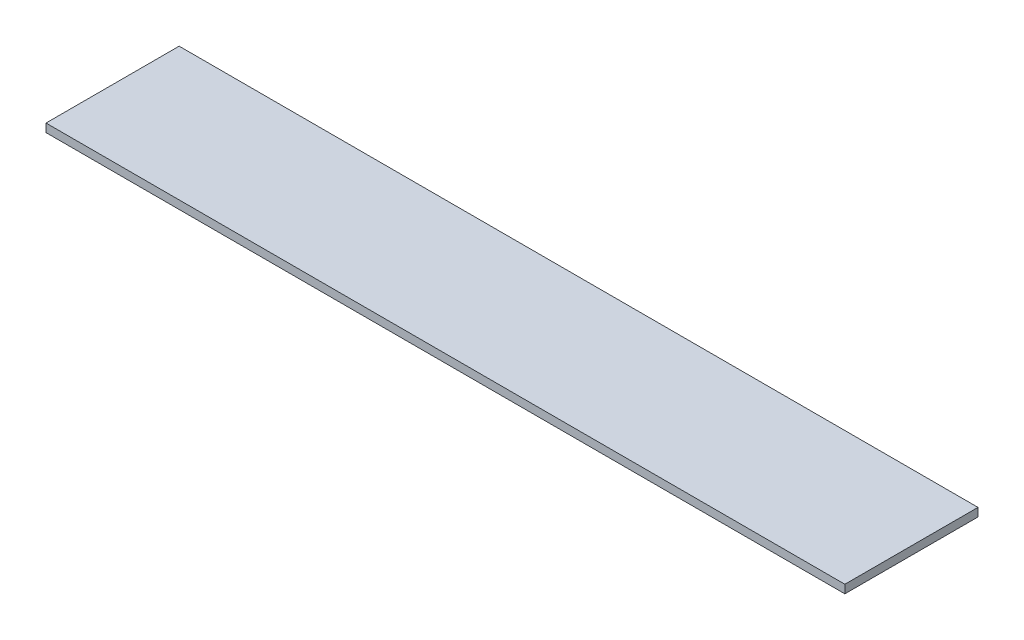
ISO-10303-21;
HEADER;
FILE_DESCRIPTION(('STEP AP214'),'2;1');
FILE_NAME('part.step','',(''),(''),'','','');
FILE_SCHEMA(('AUTOMOTIVE_DESIGN { 1 0 10303 214 1 1 1 1 }'));
ENDSEC;
DATA;
#1=APPLICATION_CONTEXT('core data for automotive mechanical design processes');
#2=APPLICATION_PROTOCOL_DEFINITION('international standard','automotive_design',2000,#1);
#3=PRODUCT_CONTEXT('',#1,'mechanical');
#4=PRODUCT('Part','Part','',(#3));
#5=PRODUCT_RELATED_PRODUCT_CATEGORY('part','',(#4));
#6=PRODUCT_DEFINITION_FORMATION('','',#4);
#7=PRODUCT_DEFINITION_CONTEXT('part definition',#1,'design');
#8=PRODUCT_DEFINITION('design','',#6,#7);
#9=PRODUCT_DEFINITION_SHAPE('','',#8);
#10=(LENGTH_UNIT() NAMED_UNIT(*) SI_UNIT(.MILLI.,.METRE.));
#11=(NAMED_UNIT(*) PLANE_ANGLE_UNIT() SI_UNIT($,.RADIAN.));
#12=(NAMED_UNIT(*) SI_UNIT($,.STERADIAN.) SOLID_ANGLE_UNIT());
#13=UNCERTAINTY_MEASURE_WITH_UNIT(LENGTH_MEASURE(1.E-05),#10,'distance_accuracy_value','');
#14=(GEOMETRIC_REPRESENTATION_CONTEXT(3) GLOBAL_UNCERTAINTY_ASSIGNED_CONTEXT((#13)) GLOBAL_UNIT_ASSIGNED_CONTEXT((#10,
#11,#12)) REPRESENTATION_CONTEXT('',''));
#15=CARTESIAN_POINT('',(0.,0.,0.));
#16=DIRECTION('',(0.,0.,1.));
#17=DIRECTION('',(1.,0.,0.));
#18=AXIS2_PLACEMENT_3D('',#15,#16,#17);
#19=CARTESIAN_POINT('',(0.,1.5875,0.));
#20=DIRECTION('',(1.,0.,0.));
#21=DIRECTION('',(0.,0.,-1.));
#22=AXIS2_PLACEMENT_3D('',#19,#20,#21);
#23=PLANE('',#22);
#24=DIRECTION('',(0.,0.,1.));
#25=VECTOR('',#24,1.);
#26=CARTESIAN_POINT('',(0.,0.,0.));
#27=LINE('',#26,#25);
#28=CARTESIAN_POINT('',(0.,0.,-25.4));
#29=VERTEX_POINT('',#28);
#30=CARTESIAN_POINT('',(0.,0.,0.));
#31=VERTEX_POINT('',#30);
#32=EDGE_CURVE('E96',#29,#31,#27,.T.);
#33=ORIENTED_EDGE('',*,*,#32,.T.);
#34=DIRECTION('',(0.,-1.,0.));
#35=VECTOR('',#34,1.);
#36=CARTESIAN_POINT('',(0.,1.5875,0.));
#37=LINE('',#36,#35);
#38=CARTESIAN_POINT('',(0.,1.5875,0.));
#39=VERTEX_POINT('',#38);
#40=EDGE_CURVE('E11',#39,#31,#37,.T.);
#41=ORIENTED_EDGE('',*,*,#40,.F.);
#42=DIRECTION('',(0.,0.,1.));
#43=VECTOR('',#42,1.);
#44=CARTESIAN_POINT('',(0.,1.5875,0.));
#45=LINE('',#44,#43);
#46=CARTESIAN_POINT('',(0.,1.5875,-25.4));
#47=VERTEX_POINT('',#46);
#48=EDGE_CURVE('E84',#47,#39,#45,.T.);
#49=ORIENTED_EDGE('',*,*,#48,.F.);
#50=DIRECTION('',(0.,-1.,0.));
#51=VECTOR('',#50,1.);
#52=CARTESIAN_POINT('',(0.,1.5875,-25.4));
#53=LINE('',#52,#51);
#54=EDGE_CURVE('E92',#47,#29,#53,.T.);
#55=ORIENTED_EDGE('',*,*,#54,.T.);
#56=EDGE_LOOP('',(#33,#41,#49,#55));
#57=FACE_BOUND('',#56,.T.);
#58=ADVANCED_FACE('F33',(#57),#23,.F.);
#59=CARTESIAN_POINT('',(0.,1.5875,0.));
#60=DIRECTION('',(0.,0.,-1.));
#61=DIRECTION('',(-1.,0.,0.));
#62=AXIS2_PLACEMENT_3D('',#59,#60,#61);
#63=PLANE('',#62);
#64=DIRECTION('',(1.,0.,0.));
#65=VECTOR('',#64,1.);
#66=CARTESIAN_POINT('',(0.,0.,0.));
#67=LINE('',#66,#65);
#68=CARTESIAN_POINT('',(152.4,0.,0.));
#69=VERTEX_POINT('',#68);
#70=EDGE_CURVE('E88',#31,#69,#67,.T.);
#71=ORIENTED_EDGE('',*,*,#70,.T.);
#72=DIRECTION('',(0.,-1.,0.));
#73=VECTOR('',#72,1.);
#74=CARTESIAN_POINT('',(152.4,1.5875,0.));
#75=LINE('',#74,#73);
#76=CARTESIAN_POINT('',(152.4,1.5875,0.));
#77=VERTEX_POINT('',#76);
#78=EDGE_CURVE('E41',#77,#69,#75,.T.);
#79=ORIENTED_EDGE('',*,*,#78,.F.);
#80=DIRECTION('',(1.,0.,0.));
#81=VECTOR('',#80,1.);
#82=CARTESIAN_POINT('',(0.,1.5875,0.));
#83=LINE('',#82,#81);
#84=EDGE_CURVE('E79',#39,#77,#83,.T.);
#85=ORIENTED_EDGE('',*,*,#84,.F.);
#86=ORIENTED_EDGE('',*,*,#40,.T.);
#87=EDGE_LOOP('',(#71,#79,#85,#86));
#88=FACE_BOUND('',#87,.T.);
#89=ADVANCED_FACE('F87',(#88),#63,.F.);
#90=CARTESIAN_POINT('',(152.4,1.5875,0.));
#91=DIRECTION('',(-1.,0.,0.));
#92=DIRECTION('',(0.,0.,1.));
#93=AXIS2_PLACEMENT_3D('',#90,#91,#92);
#94=PLANE('',#93);
#95=DIRECTION('',(0.,0.,-1.));
#96=VECTOR('',#95,1.);
#97=CARTESIAN_POINT('',(152.4,0.,0.));
#98=LINE('',#97,#96);
#99=CARTESIAN_POINT('',(152.4,0.,-25.4));
#100=VERTEX_POINT('',#99);
#101=EDGE_CURVE('E66',#69,#100,#98,.T.);
#102=ORIENTED_EDGE('',*,*,#101,.T.);
#103=DIRECTION('',(0.,-1.,0.));
#104=VECTOR('',#103,1.);
#105=CARTESIAN_POINT('',(152.4,1.5875,-25.4));
#106=LINE('',#105,#104);
#107=CARTESIAN_POINT('',(152.4,1.5875,-25.4));
#108=VERTEX_POINT('',#107);
#109=EDGE_CURVE('E89',#108,#100,#106,.T.);
#110=ORIENTED_EDGE('',*,*,#109,.F.);
#111=DIRECTION('',(0.,0.,-1.));
#112=VECTOR('',#111,1.);
#113=CARTESIAN_POINT('',(152.4,1.5875,0.));
#114=LINE('',#113,#112);
#115=EDGE_CURVE('E82',#77,#108,#114,.T.);
#116=ORIENTED_EDGE('',*,*,#115,.F.);
#117=ORIENTED_EDGE('',*,*,#78,.T.);
#118=EDGE_LOOP('',(#102,#110,#116,#117));
#119=FACE_BOUND('',#118,.T.);
#120=ADVANCED_FACE('F90',(#119),#94,.F.);
#121=CARTESIAN_POINT('',(0.,1.5875,-25.4));
#122=DIRECTION('',(0.,0.,1.));
#123=DIRECTION('',(1.,0.,0.));
#124=AXIS2_PLACEMENT_3D('',#121,#122,#123);
#125=PLANE('',#124);
#126=DIRECTION('',(-1.,0.,0.));
#127=VECTOR('',#126,1.);
#128=CARTESIAN_POINT('',(0.,0.,-25.4));
#129=LINE('',#128,#127);
#130=EDGE_CURVE('E72',#100,#29,#129,.T.);
#131=ORIENTED_EDGE('',*,*,#130,.T.);
#132=ORIENTED_EDGE('',*,*,#54,.F.);
#133=DIRECTION('',(-1.,0.,0.));
#134=VECTOR('',#133,1.);
#135=CARTESIAN_POINT('',(0.,1.5875,-25.4));
#136=LINE('',#135,#134);
#137=EDGE_CURVE('E49',#108,#47,#136,.T.);
#138=ORIENTED_EDGE('',*,*,#137,.F.);
#139=ORIENTED_EDGE('',*,*,#109,.T.);
#140=EDGE_LOOP('',(#131,#132,#138,#139));
#141=FACE_BOUND('',#140,.T.);
#142=ADVANCED_FACE('F103',(#141),#125,.F.);
#143=CARTESIAN_POINT('',(0.,1.5875,0.));
#144=DIRECTION('',(0.,-1.,0.));
#145=DIRECTION('',(0.,0.,-1.));
#146=AXIS2_PLACEMENT_3D('',#143,#144,#145);
#147=PLANE('',#146);
#148=ORIENTED_EDGE('',*,*,#48,.T.);
#149=ORIENTED_EDGE('',*,*,#84,.T.);
#150=ORIENTED_EDGE('',*,*,#115,.T.);
#151=ORIENTED_EDGE('',*,*,#137,.T.);
#152=EDGE_LOOP('',(#148,#149,#150,#151));
#153=FACE_BOUND('',#152,.T.);
#154=ADVANCED_FACE('F80',(#153),#147,.F.);
#155=CARTESIAN_POINT('',(0.,0.,0.));
#156=DIRECTION('',(0.,-1.,0.));
#157=DIRECTION('',(0.,0.,-1.));
#158=AXIS2_PLACEMENT_3D('',#155,#156,#157);
#159=PLANE('',#158);
#160=ORIENTED_EDGE('',*,*,#32,.F.);
#161=ORIENTED_EDGE('',*,*,#130,.F.);
#162=ORIENTED_EDGE('',*,*,#101,.F.);
#163=ORIENTED_EDGE('',*,*,#70,.F.);
#164=EDGE_LOOP('',(#160,#161,#162,#163));
#165=FACE_BOUND('',#164,.T.);
#166=ADVANCED_FACE('F106',(#165),#159,.T.);
#167=CLOSED_SHELL('',(#58,#89,#120,#142,#154,#166));
#168=MANIFOLD_SOLID_BREP('B2',#167);
#169=ADVANCED_BREP_SHAPE_REPRESENTATION('',(#18,#168),#14);
#170=SHAPE_DEFINITION_REPRESENTATION(#9,#169);
ENDSEC;
END-ISO-10303-21;
